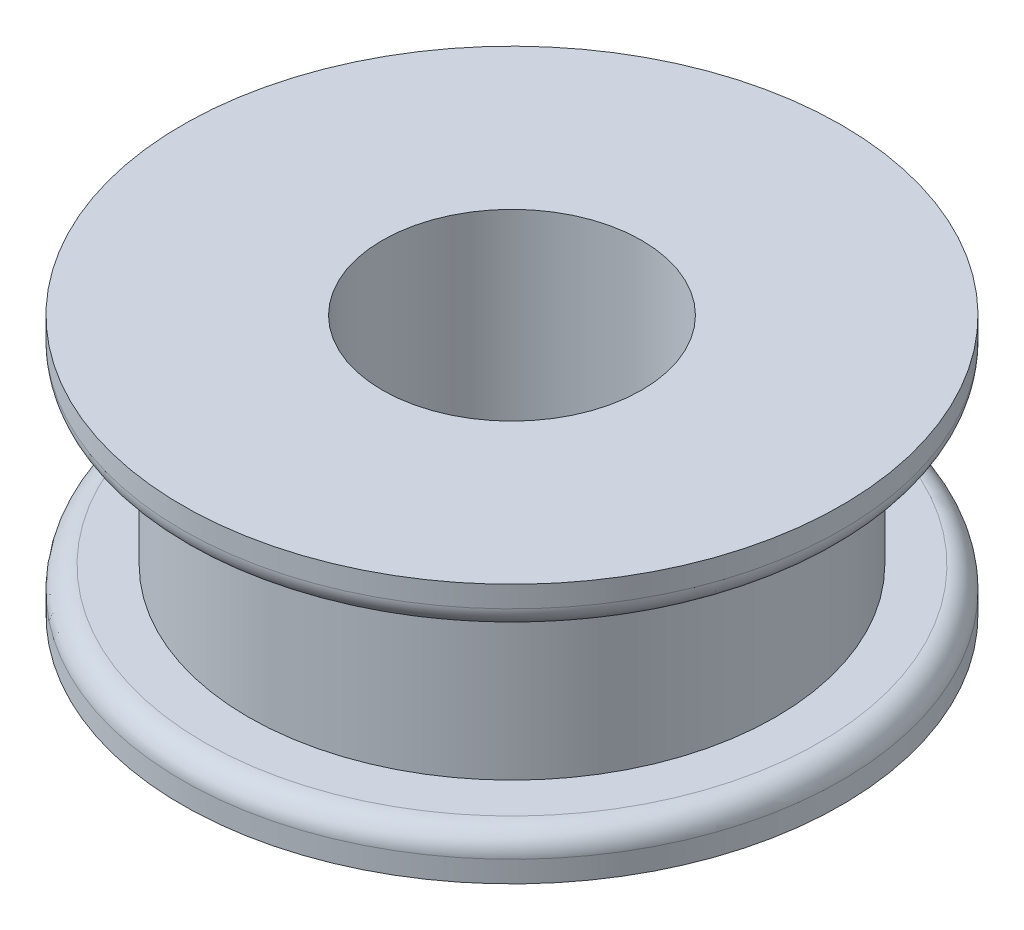
ISO-10303-21;
HEADER;
FILE_DESCRIPTION(('STEP AP214'),'2;1');
FILE_NAME('part.step','',(''),(''),'','','');
FILE_SCHEMA(('AUTOMOTIVE_DESIGN { 1 0 10303 214 1 1 1 1 }'));
ENDSEC;
DATA;
#1=APPLICATION_CONTEXT('core data for automotive mechanical design processes');
#2=APPLICATION_PROTOCOL_DEFINITION('international standard','automotive_design',2000,#1);
#3=PRODUCT_CONTEXT('',#1,'mechanical');
#4=PRODUCT('Part','Part','',(#3));
#5=PRODUCT_RELATED_PRODUCT_CATEGORY('part','',(#4));
#6=PRODUCT_DEFINITION_FORMATION('','',#4);
#7=PRODUCT_DEFINITION_CONTEXT('part definition',#1,'design');
#8=PRODUCT_DEFINITION('design','',#6,#7);
#9=PRODUCT_DEFINITION_SHAPE('','',#8);
#10=(LENGTH_UNIT() NAMED_UNIT(*) SI_UNIT(.MILLI.,.METRE.));
#11=(NAMED_UNIT(*) PLANE_ANGLE_UNIT() SI_UNIT($,.RADIAN.));
#12=(NAMED_UNIT(*) SI_UNIT($,.STERADIAN.) SOLID_ANGLE_UNIT());
#13=UNCERTAINTY_MEASURE_WITH_UNIT(LENGTH_MEASURE(1.E-05),#10,'distance_accuracy_value','');
#14=(GEOMETRIC_REPRESENTATION_CONTEXT(3) GLOBAL_UNCERTAINTY_ASSIGNED_CONTEXT((#13)) GLOBAL_UNIT_ASSIGNED_CONTEXT((#10,
#11,#12)) REPRESENTATION_CONTEXT('',''));
#15=CARTESIAN_POINT('',(0.,0.,0.));
#16=DIRECTION('',(0.,0.,1.));
#17=DIRECTION('',(1.,0.,0.));
#18=AXIS2_PLACEMENT_3D('',#15,#16,#17);
#19=CARTESIAN_POINT('',(0.,0.,7.62));
#20=DIRECTION('',(0.,-1.,0.));
#21=DIRECTION('',(0.,0.,-1.));
#22=AXIS2_PLACEMENT_3D('',#19,#20,#21);
#23=PLANE('',#22);
#24=CARTESIAN_POINT('',(0.,0.,0.));
#25=DIRECTION('',(0.,-1.,0.));
#26=DIRECTION('',(0.,0.,-1.));
#27=AXIS2_PLACEMENT_3D('',#24,#25,#26);
#28=CIRCLE('',#27,7.62);
#29=CARTESIAN_POINT('',(0.,0.,-7.62));
#30=VERTEX_POINT('',#29);
#31=EDGE_CURVE('E87',#30,#30,#28,.T.);
#32=ORIENTED_EDGE('',*,*,#31,.F.);
#33=EDGE_LOOP('',(#32));
#34=FACE_BOUND('',#33,.T.);
#35=CARTESIAN_POINT('',(0.,0.,0.));
#36=DIRECTION('',(0.,-1.,0.));
#37=DIRECTION('',(0.,0.,-1.));
#38=AXIS2_PLACEMENT_3D('',#35,#36,#37);
#39=CIRCLE('',#38,3.000000096);
#40=CARTESIAN_POINT('',(0.,0.,-3.000000096));
#41=VERTEX_POINT('',#40);
#42=EDGE_CURVE('E67',#41,#41,#39,.T.);
#43=ORIENTED_EDGE('',*,*,#42,.T.);
#44=EDGE_LOOP('',(#43));
#45=FACE_BOUND('',#44,.T.);
#46=ADVANCED_FACE('F43',(#34,#45),#23,.F.);
#47=CARTESIAN_POINT('',(0.,-39.0415865134538,0.));
#48=DIRECTION('',(0.,-1.,0.));
#49=DIRECTION('',(0.,0.,-1.));
#50=AXIS2_PLACEMENT_3D('',#47,#48,#49);
#51=CYLINDRICAL_SURFACE('',#50,3.000000096);
#52=ORIENTED_EDGE('',*,*,#42,.F.);
#53=EDGE_LOOP('',(#52));
#54=FACE_BOUND('',#53,.T.);
#55=CARTESIAN_POINT('',(0.,-6.000000192,0.));
#56=DIRECTION('',(0.,-1.,0.));
#57=DIRECTION('',(0.,0.,-1.));
#58=AXIS2_PLACEMENT_3D('',#55,#56,#57);
#59=CIRCLE('',#58,3.000000096);
#60=CARTESIAN_POINT('',(0.,-6.000000192,-3.000000096));
#61=VERTEX_POINT('',#60);
#62=EDGE_CURVE('E71',#61,#61,#59,.T.);
#63=ORIENTED_EDGE('',*,*,#62,.T.);
#64=EDGE_LOOP('',(#63));
#65=FACE_BOUND('',#64,.T.);
#66=ADVANCED_FACE('F96',(#54,#65),#51,.F.);
#67=CARTESIAN_POINT('',(0.,-6.000000192,3.000000096));
#68=DIRECTION('',(0.,1.,0.));
#69=DIRECTION('',(0.,0.,1.));
#70=AXIS2_PLACEMENT_3D('',#67,#68,#69);
#71=PLANE('',#70);
#72=ORIENTED_EDGE('',*,*,#62,.F.);
#73=EDGE_LOOP('',(#72));
#74=FACE_BOUND('',#73,.T.);
#75=CARTESIAN_POINT('',(0.,-6.000000192,0.));
#76=DIRECTION('',(0.,-1.,0.));
#77=DIRECTION('',(0.,0.,-1.));
#78=AXIS2_PLACEMENT_3D('',#75,#76,#77);
#79=CIRCLE('',#78,7.62);
#80=CARTESIAN_POINT('',(0.,-6.000000192,-7.62));
#81=VERTEX_POINT('',#80);
#82=EDGE_CURVE('E75',#81,#81,#79,.T.);
#83=ORIENTED_EDGE('',*,*,#82,.T.);
#84=EDGE_LOOP('',(#83));
#85=FACE_BOUND('',#84,.T.);
#86=ADVANCED_FACE('F102',(#74,#85),#71,.F.);
#87=CARTESIAN_POINT('',(0.,-39.0415865134538,0.));
#88=DIRECTION('',(0.,-1.,0.));
#89=DIRECTION('',(0.,0.,-1.));
#90=AXIS2_PLACEMENT_3D('',#87,#88,#89);
#91=CYLINDRICAL_SURFACE('',#90,7.62);
#92=CARTESIAN_POINT('',(0.,-5.50800016,0.));
#93=DIRECTION('',(0.,-1.,0.));
#94=DIRECTION('',(0.,0.,-1.));
#95=AXIS2_PLACEMENT_3D('',#92,#93,#94);
#96=CIRCLE('',#95,7.62);
#97=CARTESIAN_POINT('',(0.,-5.50800016,-7.62));
#98=VERTEX_POINT('',#97);
#99=EDGE_CURVE('E61',#98,#98,#96,.T.);
#100=ORIENTED_EDGE('',*,*,#99,.T.);
#101=EDGE_LOOP('',(#100));
#102=FACE_BOUND('',#101,.T.);
#103=ORIENTED_EDGE('',*,*,#82,.F.);
#104=EDGE_LOOP('',(#103));
#105=FACE_BOUND('',#104,.T.);
#106=ADVANCED_FACE('F108',(#102,#105),#91,.T.);
#107=CARTESIAN_POINT('',(0.,-5.00000016,7.62));
#108=DIRECTION('',(0.,-1.,0.));
#109=DIRECTION('',(0.,0.,-1.));
#110=AXIS2_PLACEMENT_3D('',#107,#108,#109);
#111=PLANE('',#110);
#112=CARTESIAN_POINT('',(0.,-5.00000016,0.));
#113=DIRECTION('',(0.,-1.,0.));
#114=DIRECTION('',(0.,0.,-1.));
#115=AXIS2_PLACEMENT_3D('',#112,#113,#114);
#116=CIRCLE('',#115,7.112);
#117=CARTESIAN_POINT('',(0.,-5.00000016,-7.112));
#118=VERTEX_POINT('',#117);
#119=EDGE_CURVE('E56',#118,#118,#116,.F.);
#120=ORIENTED_EDGE('',*,*,#119,.T.);
#121=EDGE_LOOP('',(#120));
#122=FACE_BOUND('',#121,.T.);
#123=CARTESIAN_POINT('',(0.,-5.00000016,0.));
#124=DIRECTION('',(0.,-1.,0.));
#125=DIRECTION('',(0.,0.,-1.));
#126=AXIS2_PLACEMENT_3D('',#123,#124,#125);
#127=CIRCLE('',#126,6.096);
#128=CARTESIAN_POINT('',(0.,-5.00000016,-6.096));
#129=VERTEX_POINT('',#128);
#130=EDGE_CURVE('E79',#129,#129,#127,.T.);
#131=ORIENTED_EDGE('',*,*,#130,.T.);
#132=EDGE_LOOP('',(#131));
#133=FACE_BOUND('',#132,.T.);
#134=ADVANCED_FACE('F113',(#122,#133),#111,.F.);
#135=CARTESIAN_POINT('',(0.,-39.0415865134538,0.));
#136=DIRECTION('',(0.,-1.,0.));
#137=DIRECTION('',(0.,0.,-1.));
#138=AXIS2_PLACEMENT_3D('',#135,#136,#137);
#139=CYLINDRICAL_SURFACE('',#138,6.096);
#140=ORIENTED_EDGE('',*,*,#130,.F.);
#141=EDGE_LOOP('',(#140));
#142=FACE_BOUND('',#141,.T.);
#143=CARTESIAN_POINT('',(0.,-1.000000032,0.));
#144=DIRECTION('',(0.,-1.,0.));
#145=DIRECTION('',(0.,0.,-1.));
#146=AXIS2_PLACEMENT_3D('',#143,#144,#145);
#147=CIRCLE('',#146,6.096);
#148=CARTESIAN_POINT('',(0.,-1.000000032,-6.096));
#149=VERTEX_POINT('',#148);
#150=EDGE_CURVE('E83',#149,#149,#147,.T.);
#151=ORIENTED_EDGE('',*,*,#150,.T.);
#152=EDGE_LOOP('',(#151));
#153=FACE_BOUND('',#152,.T.);
#154=ADVANCED_FACE('F120',(#142,#153),#139,.T.);
#155=CARTESIAN_POINT('',(0.,-1.000000032,6.096));
#156=DIRECTION('',(0.,1.,0.));
#157=DIRECTION('',(0.,0.,1.));
#158=AXIS2_PLACEMENT_3D('',#155,#156,#157);
#159=PLANE('',#158);
#160=CARTESIAN_POINT('',(0.,-1.000000032,0.));
#161=DIRECTION('',(0.,1.,0.));
#162=DIRECTION('',(0.,0.,1.));
#163=AXIS2_PLACEMENT_3D('',#160,#161,#162);
#164=CIRCLE('',#163,7.112);
#165=CARTESIAN_POINT('',(0.,-1.000000032,7.112));
#166=VERTEX_POINT('',#165);
#167=EDGE_CURVE('E51',#166,#166,#164,.F.);
#168=ORIENTED_EDGE('',*,*,#167,.T.);
#169=EDGE_LOOP('',(#168));
#170=FACE_BOUND('',#169,.T.);
#171=ORIENTED_EDGE('',*,*,#150,.F.);
#172=EDGE_LOOP('',(#171));
#173=FACE_BOUND('',#172,.T.);
#174=ADVANCED_FACE('F132',(#170,#173),#159,.F.);
#175=CARTESIAN_POINT('',(0.,-39.0415865134538,0.));
#176=DIRECTION('',(0.,-1.,0.));
#177=DIRECTION('',(0.,0.,-1.));
#178=AXIS2_PLACEMENT_3D('',#175,#176,#177);
#179=CYLINDRICAL_SURFACE('',#178,7.62);
#180=CARTESIAN_POINT('',(0.,-0.492000031999999,0.));
#181=DIRECTION('',(0.,1.,0.));
#182=DIRECTION('',(0.,0.,1.));
#183=AXIS2_PLACEMENT_3D('',#180,#181,#182);
#184=CIRCLE('',#183,7.62);
#185=CARTESIAN_POINT('',(0.,-0.492000031999999,7.62));
#186=VERTEX_POINT('',#185);
#187=EDGE_CURVE('E10',#186,#186,#184,.T.);
#188=ORIENTED_EDGE('',*,*,#187,.T.);
#189=EDGE_LOOP('',(#188));
#190=FACE_BOUND('',#189,.T.);
#191=ORIENTED_EDGE('',*,*,#31,.T.);
#192=EDGE_LOOP('',(#191));
#193=FACE_BOUND('',#192,.T.);
#194=ADVANCED_FACE('F92',(#190,#193),#179,.T.);
#195=CARTESIAN_POINT('',(0.,-5.50800016,0.));
#196=DIRECTION('',(0.,-1.,0.));
#197=DIRECTION('',(0.,0.,-1.));
#198=AXIS2_PLACEMENT_3D('',#195,#196,#197);
#199=TOROIDAL_SURFACE('',#198,7.112,0.508);
#200=ORIENTED_EDGE('',*,*,#119,.F.);
#201=EDGE_LOOP('',(#200));
#202=FACE_BOUND('',#201,.T.);
#203=ORIENTED_EDGE('',*,*,#99,.F.);
#204=EDGE_LOOP('',(#203));
#205=FACE_BOUND('',#204,.T.);
#206=ADVANCED_FACE('F124',(#202,#205),#199,.T.);
#207=CARTESIAN_POINT('',(0.,-0.492000031999999,0.));
#208=DIRECTION('',(0.,1.,0.));
#209=DIRECTION('',(0.,0.,1.));
#210=AXIS2_PLACEMENT_3D('',#207,#208,#209);
#211=TOROIDAL_SURFACE('',#210,7.112,0.508);
#212=ORIENTED_EDGE('',*,*,#187,.F.);
#213=EDGE_LOOP('',(#212));
#214=FACE_BOUND('',#213,.T.);
#215=ORIENTED_EDGE('',*,*,#167,.F.);
#216=EDGE_LOOP('',(#215));
#217=FACE_BOUND('',#216,.T.);
#218=ADVANCED_FACE('F45',(#214,#217),#211,.T.);
#219=CLOSED_SHELL('',(#46,#66,#86,#106,#134,#154,#174,#194,#206,#218));
#220=MANIFOLD_SOLID_BREP('B2',#219);
#221=ADVANCED_BREP_SHAPE_REPRESENTATION('',(#18,#220),#14);
#222=SHAPE_DEFINITION_REPRESENTATION(#9,#221);
ENDSEC;
END-ISO-10303-21;
